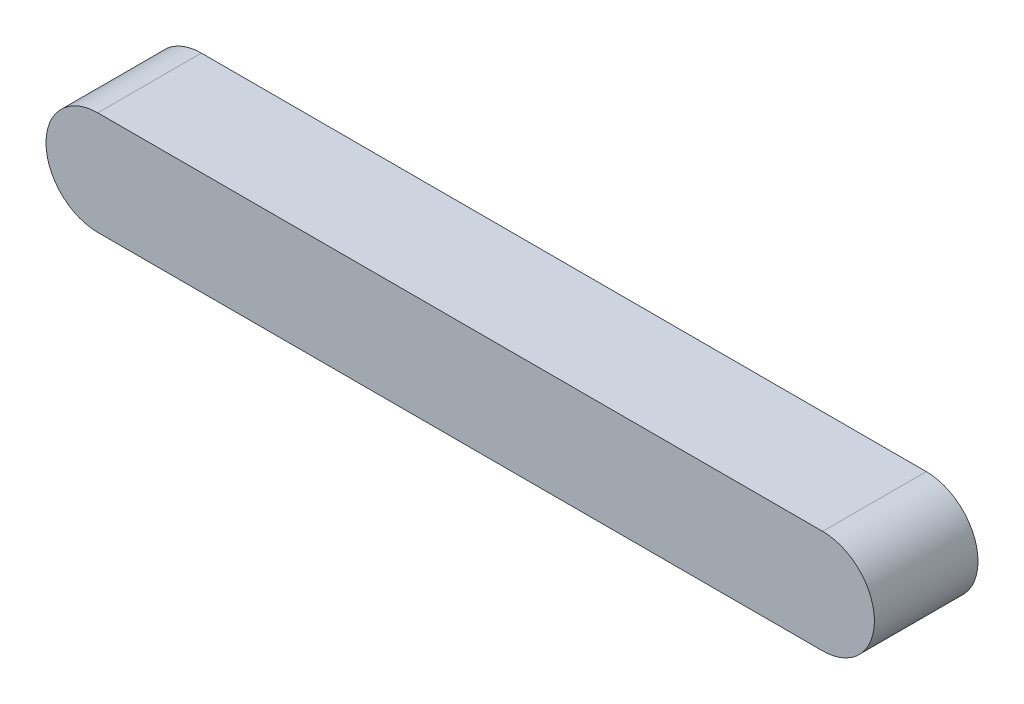
ISO-10303-21;
HEADER;
FILE_DESCRIPTION(('STEP AP214'),'2;1');
FILE_NAME('part.step','',(''),(''),'','','');
FILE_SCHEMA(('AUTOMOTIVE_DESIGN { 1 0 10303 214 1 1 1 1 }'));
ENDSEC;
DATA;
#1=APPLICATION_CONTEXT('core data for automotive mechanical design processes');
#2=APPLICATION_PROTOCOL_DEFINITION('international standard','automotive_design',2000,#1);
#3=PRODUCT_CONTEXT('',#1,'mechanical');
#4=PRODUCT('Part','Part','',(#3));
#5=PRODUCT_RELATED_PRODUCT_CATEGORY('part','',(#4));
#6=PRODUCT_DEFINITION_FORMATION('','',#4);
#7=PRODUCT_DEFINITION_CONTEXT('part definition',#1,'design');
#8=PRODUCT_DEFINITION('design','',#6,#7);
#9=PRODUCT_DEFINITION_SHAPE('','',#8);
#10=(LENGTH_UNIT() NAMED_UNIT(*) SI_UNIT(.MILLI.,.METRE.));
#11=(NAMED_UNIT(*) PLANE_ANGLE_UNIT() SI_UNIT($,.RADIAN.));
#12=(NAMED_UNIT(*) SI_UNIT($,.STERADIAN.) SOLID_ANGLE_UNIT());
#13=UNCERTAINTY_MEASURE_WITH_UNIT(LENGTH_MEASURE(1.E-05),#10,'distance_accuracy_value','');
#14=(GEOMETRIC_REPRESENTATION_CONTEXT(3) GLOBAL_UNCERTAINTY_ASSIGNED_CONTEXT((#13)) GLOBAL_UNIT_ASSIGNED_CONTEXT((#10,
#11,#12)) REPRESENTATION_CONTEXT('',''));
#15=CARTESIAN_POINT('',(0.,0.,0.));
#16=DIRECTION('',(0.,0.,1.));
#17=DIRECTION('',(1.,0.,0.));
#18=AXIS2_PLACEMENT_3D('',#15,#16,#17);
#19=CARTESIAN_POINT('',(0.,12.7,25.4));
#20=DIRECTION('',(0.,0.,-1.));
#21=DIRECTION('',(-1.,0.,0.));
#22=AXIS2_PLACEMENT_3D('',#19,#20,#21);
#23=CYLINDRICAL_SURFACE('',#22,12.7);
#24=CARTESIAN_POINT('',(0.,12.7,0.));
#25=DIRECTION('',(0.,0.,1.));
#26=DIRECTION('',(1.,0.,0.));
#27=AXIS2_PLACEMENT_3D('',#24,#25,#26);
#28=CIRCLE('',#27,12.7);
#29=CARTESIAN_POINT('',(0.,25.4,0.));
#30=VERTEX_POINT('',#29);
#31=CARTESIAN_POINT('',(0.,0.,0.));
#32=VERTEX_POINT('',#31);
#33=EDGE_CURVE('E104',#30,#32,#28,.T.);
#34=ORIENTED_EDGE('',*,*,#33,.T.);
#35=DIRECTION('',(0.,0.,-1.));
#36=VECTOR('',#35,1.);
#37=CARTESIAN_POINT('',(0.,0.,25.4));
#38=LINE('',#37,#36);
#39=CARTESIAN_POINT('',(0.,0.,25.4));
#40=VERTEX_POINT('',#39);
#41=EDGE_CURVE('E11',#40,#32,#38,.T.);
#42=ORIENTED_EDGE('',*,*,#41,.F.);
#43=CARTESIAN_POINT('',(0.,12.7,25.4));
#44=DIRECTION('',(0.,0.,1.));
#45=DIRECTION('',(1.,0.,0.));
#46=AXIS2_PLACEMENT_3D('',#43,#44,#45);
#47=CIRCLE('',#46,12.7);
#48=CARTESIAN_POINT('',(0.,25.4,25.4));
#49=VERTEX_POINT('',#48);
#50=EDGE_CURVE('E90',#49,#40,#47,.T.);
#51=ORIENTED_EDGE('',*,*,#50,.F.);
#52=DIRECTION('',(0.,0.,-1.));
#53=VECTOR('',#52,1.);
#54=CARTESIAN_POINT('',(0.,25.4,25.4));
#55=LINE('',#54,#53);
#56=EDGE_CURVE('E57',#49,#30,#55,.T.);
#57=ORIENTED_EDGE('',*,*,#56,.T.);
#58=EDGE_LOOP('',(#34,#42,#51,#57));
#59=FACE_BOUND('',#58,.T.);
#60=ADVANCED_FACE('F41',(#59),#23,.T.);
#61=CARTESIAN_POINT('',(0.,0.,25.4));
#62=DIRECTION('',(0.,1.,0.));
#63=DIRECTION('',(0.,0.,1.));
#64=AXIS2_PLACEMENT_3D('',#61,#62,#63);
#65=PLANE('',#64);
#66=DIRECTION('',(1.,0.,0.));
#67=VECTOR('',#66,1.);
#68=CARTESIAN_POINT('',(0.,0.,0.));
#69=LINE('',#68,#67);
#70=CARTESIAN_POINT('',(177.8,0.,0.));
#71=VERTEX_POINT('',#70);
#72=EDGE_CURVE('E95',#32,#71,#69,.T.);
#73=ORIENTED_EDGE('',*,*,#72,.T.);
#74=DIRECTION('',(0.,0.,-1.));
#75=VECTOR('',#74,1.);
#76=CARTESIAN_POINT('',(177.8,0.,25.4));
#77=LINE('',#76,#75);
#78=CARTESIAN_POINT('',(177.8,0.,25.4));
#79=VERTEX_POINT('',#78);
#80=EDGE_CURVE('E49',#79,#71,#77,.T.);
#81=ORIENTED_EDGE('',*,*,#80,.F.);
#82=DIRECTION('',(1.,0.,0.));
#83=VECTOR('',#82,1.);
#84=CARTESIAN_POINT('',(0.,0.,25.4));
#85=LINE('',#84,#83);
#86=EDGE_CURVE('E83',#40,#79,#85,.T.);
#87=ORIENTED_EDGE('',*,*,#86,.F.);
#88=ORIENTED_EDGE('',*,*,#41,.T.);
#89=EDGE_LOOP('',(#73,#81,#87,#88));
#90=FACE_BOUND('',#89,.T.);
#91=ADVANCED_FACE('F94',(#90),#65,.F.);
#92=CARTESIAN_POINT('',(177.8,12.7,25.4));
#93=DIRECTION('',(0.,0.,-1.));
#94=DIRECTION('',(-1.,0.,0.));
#95=AXIS2_PLACEMENT_3D('',#92,#93,#94);
#96=CYLINDRICAL_SURFACE('',#95,12.7);
#97=CARTESIAN_POINT('',(177.8,12.7,0.));
#98=DIRECTION('',(0.,0.,1.));
#99=DIRECTION('',(1.,0.,0.));
#100=AXIS2_PLACEMENT_3D('',#97,#98,#99);
#101=CIRCLE('',#100,12.7);
#102=CARTESIAN_POINT('',(177.8,25.4000000000001,0.));
#103=VERTEX_POINT('',#102);
#104=EDGE_CURVE('E107',#71,#103,#101,.T.);
#105=ORIENTED_EDGE('',*,*,#104,.T.);
#106=DIRECTION('',(0.,0.,-1.));
#107=VECTOR('',#106,1.);
#108=CARTESIAN_POINT('',(177.8,25.4000000000001,25.4));
#109=LINE('',#108,#107);
#110=CARTESIAN_POINT('',(177.8,25.4000000000001,25.4));
#111=VERTEX_POINT('',#110);
#112=EDGE_CURVE('E72',#111,#103,#109,.T.);
#113=ORIENTED_EDGE('',*,*,#112,.F.);
#114=CARTESIAN_POINT('',(177.8,12.7,25.4));
#115=DIRECTION('',(0.,0.,1.));
#116=DIRECTION('',(1.,0.,0.));
#117=AXIS2_PLACEMENT_3D('',#114,#115,#116);
#118=CIRCLE('',#117,12.7);
#119=EDGE_CURVE('E89',#79,#111,#118,.T.);
#120=ORIENTED_EDGE('',*,*,#119,.F.);
#121=ORIENTED_EDGE('',*,*,#80,.T.);
#122=EDGE_LOOP('',(#105,#113,#120,#121));
#123=FACE_BOUND('',#122,.T.);
#124=ADVANCED_FACE('F98',(#123),#96,.T.);
#125=CARTESIAN_POINT('',(0.,25.4,25.4));
#126=DIRECTION('',(0.,1.,0.));
#127=DIRECTION('',(-1.,0.,0.));
#128=AXIS2_PLACEMENT_3D('',#125,#126,#127);
#129=PLANE('',#128);
#130=DIRECTION('',(1.,0.,0.));
#131=VECTOR('',#130,1.);
#132=CARTESIAN_POINT('',(0.,25.4,0.));
#133=LINE('',#132,#131);
#134=EDGE_CURVE('E109',#30,#103,#133,.T.);
#135=ORIENTED_EDGE('',*,*,#134,.F.);
#136=ORIENTED_EDGE('',*,*,#56,.F.);
#137=DIRECTION('',(1.,0.,0.));
#138=VECTOR('',#137,1.);
#139=CARTESIAN_POINT('',(0.,25.4,25.4));
#140=LINE('',#139,#138);
#141=EDGE_CURVE('E99',#49,#111,#140,.T.);
#142=ORIENTED_EDGE('',*,*,#141,.T.);
#143=ORIENTED_EDGE('',*,*,#112,.T.);
#144=EDGE_LOOP('',(#135,#136,#142,#143));
#145=FACE_BOUND('',#144,.T.);
#146=ADVANCED_FACE('F115',(#145),#129,.T.);
#147=CARTESIAN_POINT('',(0.,0.,25.4));
#148=DIRECTION('',(0.,0.,1.));
#149=DIRECTION('',(1.,0.,0.));
#150=AXIS2_PLACEMENT_3D('',#147,#148,#149);
#151=PLANE('',#150);
#152=ORIENTED_EDGE('',*,*,#50,.T.);
#153=ORIENTED_EDGE('',*,*,#86,.T.);
#154=ORIENTED_EDGE('',*,*,#119,.T.);
#155=ORIENTED_EDGE('',*,*,#141,.F.);
#156=EDGE_LOOP('',(#152,#153,#154,#155));
#157=FACE_BOUND('',#156,.T.);
#158=ADVANCED_FACE('F86',(#157),#151,.T.);
#159=CARTESIAN_POINT('',(0.,0.,0.));
#160=DIRECTION('',(0.,0.,1.));
#161=DIRECTION('',(1.,0.,0.));
#162=AXIS2_PLACEMENT_3D('',#159,#160,#161);
#163=PLANE('',#162);
#164=ORIENTED_EDGE('',*,*,#33,.F.);
#165=ORIENTED_EDGE('',*,*,#134,.T.);
#166=ORIENTED_EDGE('',*,*,#104,.F.);
#167=ORIENTED_EDGE('',*,*,#72,.F.);
#168=EDGE_LOOP('',(#164,#165,#166,#167));
#169=FACE_BOUND('',#168,.T.);
#170=ADVANCED_FACE('F114',(#169),#163,.F.);
#171=CLOSED_SHELL('',(#60,#91,#124,#146,#158,#170));
#172=MANIFOLD_SOLID_BREP('B2',#171);
#173=ADVANCED_BREP_SHAPE_REPRESENTATION('',(#18,#172),#14);
#174=SHAPE_DEFINITION_REPRESENTATION(#9,#173);
ENDSEC;
END-ISO-10303-21;
